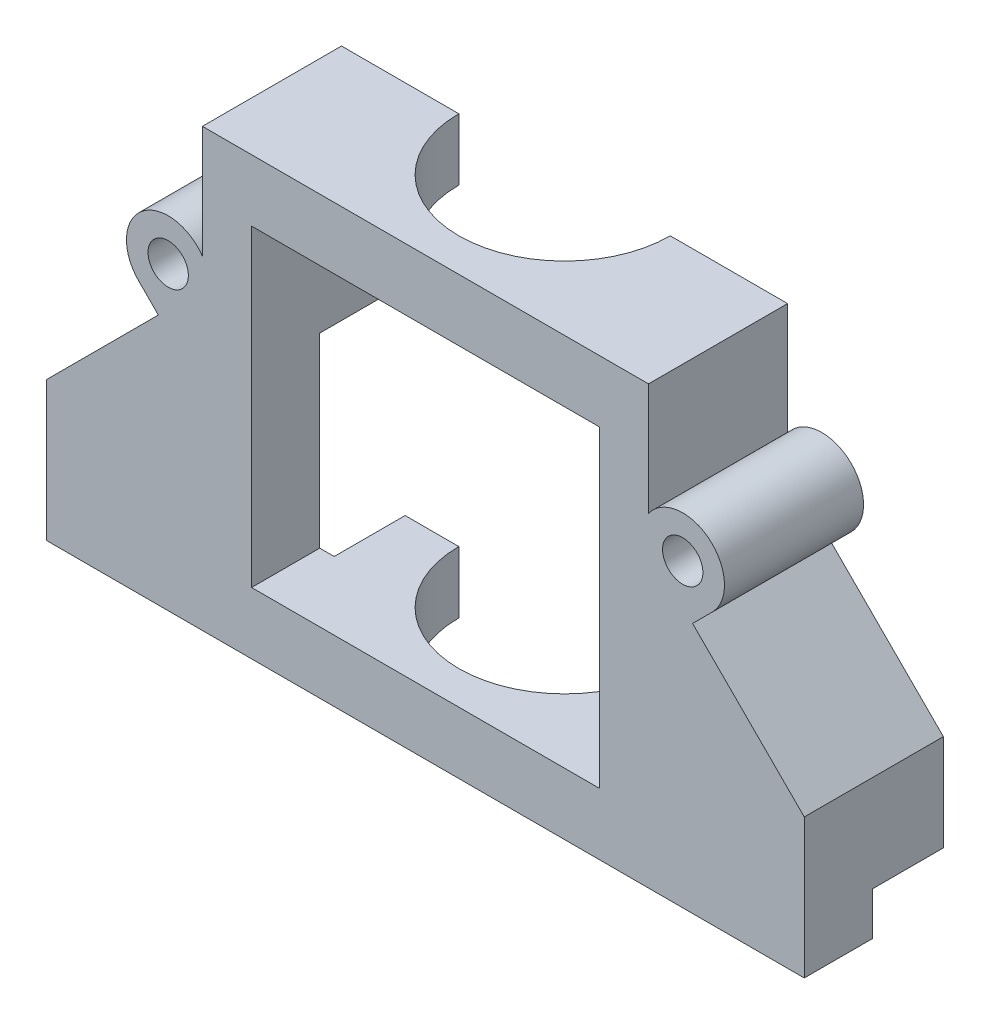
ISO-10303-21;
HEADER;
FILE_DESCRIPTION(('STEP AP214'),'2;1');
FILE_NAME('part.step','',(''),(''),'','','');
FILE_SCHEMA(('AUTOMOTIVE_DESIGN { 1 0 10303 214 1 1 1 1 }'));
ENDSEC;
DATA;
#1=APPLICATION_CONTEXT('core data for automotive mechanical design processes');
#2=APPLICATION_PROTOCOL_DEFINITION('international standard','automotive_design',2000,#1);
#3=PRODUCT_CONTEXT('',#1,'mechanical');
#4=PRODUCT('Part','Part','',(#3));
#5=PRODUCT_RELATED_PRODUCT_CATEGORY('part','',(#4));
#6=PRODUCT_DEFINITION_FORMATION('','',#4);
#7=PRODUCT_DEFINITION_CONTEXT('part definition',#1,'design');
#8=PRODUCT_DEFINITION('design','',#6,#7);
#9=PRODUCT_DEFINITION_SHAPE('','',#8);
#10=(LENGTH_UNIT() NAMED_UNIT(*) SI_UNIT(.MILLI.,.METRE.));
#11=(NAMED_UNIT(*) PLANE_ANGLE_UNIT() SI_UNIT($,.RADIAN.));
#12=(NAMED_UNIT(*) SI_UNIT($,.STERADIAN.) SOLID_ANGLE_UNIT());
#13=UNCERTAINTY_MEASURE_WITH_UNIT(LENGTH_MEASURE(1.E-05),#10,'distance_accuracy_value','');
#14=(GEOMETRIC_REPRESENTATION_CONTEXT(3) GLOBAL_UNCERTAINTY_ASSIGNED_CONTEXT((#13)) GLOBAL_UNIT_ASSIGNED_CONTEXT((#10,
#11,#12)) REPRESENTATION_CONTEXT('',''));
#15=CARTESIAN_POINT('',(0.,0.,0.));
#16=DIRECTION('',(0.,0.,1.));
#17=DIRECTION('',(1.,0.,0.));
#18=AXIS2_PLACEMENT_3D('',#15,#16,#17);
#19=CARTESIAN_POINT('',(69.1731378358659,19.3936469520584,-25.4));
#20=DIRECTION('',(0.,-1.,0.));
#21=DIRECTION('',(1.,0.,0.));
#22=AXIS2_PLACEMENT_3D('',#19,#20,#21);
#23=PLANE('',#22);
#24=DIRECTION('',(1.,0.,0.));
#25=VECTOR('',#24,1.);
#26=CARTESIAN_POINT('',(-40.4032328030978,19.3936469520584,12.954));
#27=LINE('',#26,#25);
#28=CARTESIAN_POINT('',(-69.1731378358659,19.3936469520584,12.954));
#29=VERTEX_POINT('',#28);
#30=CARTESIAN_POINT('',(-40.4032328030978,19.3936469520584,12.954));
#31=VERTEX_POINT('',#30);
#32=EDGE_CURVE('E245',#29,#31,#27,.T.);
#33=ORIENTED_EDGE('',*,*,#32,.T.);
#34=DIRECTION('',(0.,0.,-1.));
#35=VECTOR('',#34,1.);
#36=CARTESIAN_POINT('',(-40.4032328030978,19.3936469520584,12.954));
#37=LINE('',#36,#35);
#38=CARTESIAN_POINT('',(-40.4032328030978,19.3936469520584,0.));
#39=VERTEX_POINT('',#38);
#40=EDGE_CURVE('E243',#31,#39,#37,.T.);
#41=ORIENTED_EDGE('',*,*,#40,.T.);
#42=DIRECTION('',(1.,0.,0.));
#43=VECTOR('',#42,1.);
#44=CARTESIAN_POINT('',(-69.1731378358659,19.3936469520584,0.));
#45=LINE('',#44,#43);
#46=CARTESIAN_POINT('',(-19.304,19.3936469520584,0.));
#47=VERTEX_POINT('',#46);
#48=EDGE_CURVE('E395',#39,#47,#45,.T.);
#49=ORIENTED_EDGE('',*,*,#48,.T.);
#50=CARTESIAN_POINT('',(0.,19.3936469520584,0.));
#51=DIRECTION('',(0.,-1.,0.));
#52=DIRECTION('',(-1.,0.,0.));
#53=AXIS2_PLACEMENT_3D('',#50,#51,#52);
#54=CIRCLE('',#53,19.304);
#55=CARTESIAN_POINT('',(19.304,19.3936469520584,0.));
#56=VERTEX_POINT('',#55);
#57=EDGE_CURVE('E302',#56,#47,#54,.T.);
#58=ORIENTED_EDGE('',*,*,#57,.F.);
#59=CARTESIAN_POINT('',(40.4032328030978,19.3936469520584,0.));
#60=VERTEX_POINT('',#59);
#61=EDGE_CURVE('E376',#56,#60,#45,.T.);
#62=ORIENTED_EDGE('',*,*,#61,.T.);
#63=DIRECTION('',(0.,0.,-1.));
#64=VECTOR('',#63,1.);
#65=CARTESIAN_POINT('',(40.4032328030978,19.3936469520584,12.954));
#66=LINE('',#65,#64);
#67=CARTESIAN_POINT('',(40.4032328030978,19.3936469520584,12.954));
#68=VERTEX_POINT('',#67);
#69=EDGE_CURVE('E70',#68,#60,#66,.T.);
#70=ORIENTED_EDGE('',*,*,#69,.F.);
#71=DIRECTION('',(-1.,0.,0.));
#72=VECTOR('',#71,1.);
#73=CARTESIAN_POINT('',(40.4032328030978,19.3936469520584,12.954));
#74=LINE('',#73,#72);
#75=CARTESIAN_POINT('',(69.1731378358659,19.3936469520584,12.954));
#76=VERTEX_POINT('',#75);
#77=EDGE_CURVE('E276',#76,#68,#74,.T.);
#78=ORIENTED_EDGE('',*,*,#77,.F.);
#79=DIRECTION('',(0.,0.,1.));
#80=VECTOR('',#79,1.);
#81=CARTESIAN_POINT('',(69.1731378358659,19.3936469520584,-25.4));
#82=LINE('',#81,#80);
#83=CARTESIAN_POINT('',(69.1731378358659,19.3936469520584,25.4));
#84=VERTEX_POINT('',#83);
#85=EDGE_CURVE('E506',#76,#84,#82,.T.);
#86=ORIENTED_EDGE('',*,*,#85,.T.);
#87=DIRECTION('',(1.,0.,0.));
#88=VECTOR('',#87,1.);
#89=CARTESIAN_POINT('',(69.1731378358659,19.3936469520584,25.4));
#90=LINE('',#89,#88);
#91=CARTESIAN_POINT('',(-69.1731378358659,19.3936469520584,25.4));
#92=VERTEX_POINT('',#91);
#93=EDGE_CURVE('E495',#92,#84,#90,.T.);
#94=ORIENTED_EDGE('',*,*,#93,.F.);
#95=DIRECTION('',(0.,0.,1.));
#96=VECTOR('',#95,1.);
#97=CARTESIAN_POINT('',(-69.1731378358659,19.3936469520584,-25.4));
#98=LINE('',#97,#96);
#99=EDGE_CURVE('E505',#29,#92,#98,.T.);
#100=ORIENTED_EDGE('',*,*,#99,.F.);
#101=EDGE_LOOP('',(#33,#41,#49,#58,#62,#70,#78,#86,#94,#100));
#102=FACE_BOUND('',#101,.T.);
#103=ADVANCED_FACE('F46',(#102),#23,.T.);
#104=CARTESIAN_POINT('',(-69.1731378358659,19.3936469520584,-25.4));
#105=DIRECTION('',(-1.,0.,0.));
#106=DIRECTION('',(0.,0.,1.));
#107=AXIS2_PLACEMENT_3D('',#104,#105,#106);
#108=PLANE('',#107);
#109=DIRECTION('',(0.,-1.,0.));
#110=VECTOR('',#109,1.);
#111=CARTESIAN_POINT('',(-69.1731378358659,44.8644888905493,0.));
#112=LINE('',#111,#110);
#113=CARTESIAN_POINT('',(-69.1731378358659,44.8644888905493,0.));
#114=VERTEX_POINT('',#113);
#115=CARTESIAN_POINT('',(-69.1731378358659,27.2631868932537,0.));
#116=VERTEX_POINT('',#115);
#117=EDGE_CURVE('E416',#114,#116,#112,.T.);
#118=ORIENTED_EDGE('',*,*,#117,.T.);
#119=DIRECTION('',(0.,0.,-1.));
#120=VECTOR('',#119,1.);
#121=CARTESIAN_POINT('',(-69.1731378358659,27.2631868932537,12.954));
#122=LINE('',#121,#120);
#123=CARTESIAN_POINT('',(-69.1731378358659,27.2631868932537,12.954));
#124=VERTEX_POINT('',#123);
#125=EDGE_CURVE('E258',#124,#116,#122,.T.);
#126=ORIENTED_EDGE('',*,*,#125,.F.);
#127=DIRECTION('',(0.,-1.,0.));
#128=VECTOR('',#127,1.);
#129=CARTESIAN_POINT('',(-69.1731378358659,19.3936469520584,12.954));
#130=LINE('',#129,#128);
#131=EDGE_CURVE('E260',#124,#29,#130,.T.);
#132=ORIENTED_EDGE('',*,*,#131,.T.);
#133=ORIENTED_EDGE('',*,*,#99,.T.);
#134=DIRECTION('',(0.,-1.,0.));
#135=VECTOR('',#134,1.);
#136=CARTESIAN_POINT('',(-69.1731378358659,19.3936469520584,25.4));
#137=LINE('',#136,#135);
#138=CARTESIAN_POINT('',(-69.1731378358659,44.8644888905493,25.4));
#139=VERTEX_POINT('',#138);
#140=EDGE_CURVE('E481',#139,#92,#137,.T.);
#141=ORIENTED_EDGE('',*,*,#140,.F.);
#142=DIRECTION('',(0.,0.,1.));
#143=VECTOR('',#142,1.);
#144=CARTESIAN_POINT('',(-69.1731378358659,44.8644888905493,-25.4));
#145=LINE('',#144,#143);
#146=EDGE_CURVE('E457',#114,#139,#145,.T.);
#147=ORIENTED_EDGE('',*,*,#146,.F.);
#148=EDGE_LOOP('',(#118,#126,#132,#133,#141,#147));
#149=FACE_BOUND('',#148,.T.);
#150=ADVANCED_FACE('F48',(#149),#108,.T.);
#151=CARTESIAN_POINT('',(-31.75,30.6845674544502,-25.4));
#152=DIRECTION('',(-1.,0.,0.));
#153=DIRECTION('',(0.,0.,1.));
#154=AXIS2_PLACEMENT_3D('',#151,#152,#153);
#155=PLANE('',#154);
#156=DIRECTION('',(0.,0.,1.));
#157=VECTOR('',#156,1.);
#158=CARTESIAN_POINT('',(-31.75,64.6863247291196,-25.4));
#159=LINE('',#158,#157);
#160=CARTESIAN_POINT('',(-31.75,64.6863247291196,0.));
#161=VERTEX_POINT('',#160);
#162=CARTESIAN_POINT('',(-31.75,64.6863247291196,12.954));
#163=VERTEX_POINT('',#162);
#164=EDGE_CURVE('E264',#161,#163,#159,.T.);
#165=ORIENTED_EDGE('',*,*,#164,.F.);
#166=DIRECTION('',(0.,1.,0.));
#167=VECTOR('',#166,1.);
#168=CARTESIAN_POINT('',(-31.75,30.6845674544502,0.));
#169=LINE('',#168,#167);
#170=CARTESIAN_POINT('',(-31.75,87.8345674544502,0.));
#171=VERTEX_POINT('',#170);
#172=EDGE_CURVE('E428',#161,#171,#169,.T.);
#173=ORIENTED_EDGE('',*,*,#172,.T.);
#174=DIRECTION('',(0.,0.,1.));
#175=VECTOR('',#174,1.);
#176=CARTESIAN_POINT('',(-31.75,87.8345674544502,-25.4));
#177=LINE('',#176,#175);
#178=CARTESIAN_POINT('',(-31.75,87.8345674544502,25.4));
#179=VERTEX_POINT('',#178);
#180=EDGE_CURVE('E485',#171,#179,#177,.T.);
#181=ORIENTED_EDGE('',*,*,#180,.T.);
#182=DIRECTION('',(0.,-1.,0.));
#183=VECTOR('',#182,1.);
#184=CARTESIAN_POINT('',(-31.75,30.6845674544502,25.4));
#185=LINE('',#184,#183);
#186=CARTESIAN_POINT('',(-31.75,30.6845674544502,25.4));
#187=VERTEX_POINT('',#186);
#188=EDGE_CURVE('E469',#179,#187,#185,.T.);
#189=ORIENTED_EDGE('',*,*,#188,.T.);
#190=DIRECTION('',(0.,0.,1.));
#191=VECTOR('',#190,1.);
#192=CARTESIAN_POINT('',(-31.75,30.6845674544502,-25.4));
#193=LINE('',#192,#191);
#194=CARTESIAN_POINT('',(-31.75,30.6845674544502,12.954));
#195=VERTEX_POINT('',#194);
#196=EDGE_CURVE('E482',#195,#187,#193,.T.);
#197=ORIENTED_EDGE('',*,*,#196,.F.);
#198=DIRECTION('',(0.,-1.,0.));
#199=VECTOR('',#198,1.);
#200=CARTESIAN_POINT('',(-31.75,30.6845674544502,12.954));
#201=LINE('',#200,#199);
#202=EDGE_CURVE('E238',#163,#195,#201,.T.);
#203=ORIENTED_EDGE('',*,*,#202,.F.);
#204=EDGE_LOOP('',(#165,#173,#181,#189,#197,#203));
#205=FACE_BOUND('',#204,.T.);
#206=ADVANCED_FACE('F531',(#205),#155,.F.);
#207=CARTESIAN_POINT('',(-31.75,30.6845674544502,-25.4));
#208=DIRECTION('',(0.,-1.,0.));
#209=DIRECTION('',(0.,0.,-1.));
#210=AXIS2_PLACEMENT_3D('',#207,#208,#209);
#211=PLANE('',#210);
#212=DIRECTION('',(0.,0.,-1.));
#213=VECTOR('',#212,1.);
#214=CARTESIAN_POINT('',(-29.1123123007059,30.6845674544502,12.954));
#215=LINE('',#214,#213);
#216=CARTESIAN_POINT('',(-29.1123123007059,30.6845674544502,12.954));
#217=VERTEX_POINT('',#216);
#218=CARTESIAN_POINT('',(-29.1123123007059,30.6845674544502,0.));
#219=VERTEX_POINT('',#218);
#220=EDGE_CURVE('E62',#217,#219,#215,.T.);
#221=ORIENTED_EDGE('',*,*,#220,.F.);
#222=DIRECTION('',(1.,0.,0.));
#223=VECTOR('',#222,1.);
#224=CARTESIAN_POINT('',(-31.75,30.6845674544502,12.954));
#225=LINE('',#224,#223);
#226=EDGE_CURVE('E11',#195,#217,#225,.T.);
#227=ORIENTED_EDGE('',*,*,#226,.F.);
#228=ORIENTED_EDGE('',*,*,#196,.T.);
#229=DIRECTION('',(1.,0.,0.));
#230=VECTOR('',#229,1.);
#231=CARTESIAN_POINT('',(-31.75,30.6845674544502,25.4));
#232=LINE('',#231,#230);
#233=CARTESIAN_POINT('',(31.75,30.6845674544502,25.4));
#234=VERTEX_POINT('',#233);
#235=EDGE_CURVE('E473',#187,#234,#232,.T.);
#236=ORIENTED_EDGE('',*,*,#235,.T.);
#237=DIRECTION('',(0.,0.,1.));
#238=VECTOR('',#237,1.);
#239=CARTESIAN_POINT('',(31.75,30.6845674544502,-25.4));
#240=LINE('',#239,#238);
#241=CARTESIAN_POINT('',(31.75,30.6845674544502,12.954));
#242=VERTEX_POINT('',#241);
#243=EDGE_CURVE('E478',#242,#234,#240,.T.);
#244=ORIENTED_EDGE('',*,*,#243,.F.);
#245=DIRECTION('',(1.,0.,0.));
#246=VECTOR('',#245,1.);
#247=CARTESIAN_POINT('',(-31.75,30.6845674544502,12.954));
#248=LINE('',#247,#246);
#249=CARTESIAN_POINT('',(29.1123123007059,30.6845674544502,12.954));
#250=VERTEX_POINT('',#249);
#251=EDGE_CURVE('E519',#250,#242,#248,.T.);
#252=ORIENTED_EDGE('',*,*,#251,.F.);
#253=DIRECTION('',(0.,0.,-1.));
#254=VECTOR('',#253,1.);
#255=CARTESIAN_POINT('',(29.1123123007059,30.6845674544502,12.954));
#256=LINE('',#255,#254);
#257=CARTESIAN_POINT('',(29.1123123007059,30.6845674544502,0.));
#258=VERTEX_POINT('',#257);
#259=EDGE_CURVE('E286',#250,#258,#256,.T.);
#260=ORIENTED_EDGE('',*,*,#259,.T.);
#261=DIRECTION('',(-1.,0.,0.));
#262=VECTOR('',#261,1.);
#263=CARTESIAN_POINT('',(-31.75,30.6845674544502,0.));
#264=LINE('',#263,#262);
#265=CARTESIAN_POINT('',(19.304,30.6845674544502,0.));
#266=VERTEX_POINT('',#265);
#267=EDGE_CURVE('E433',#258,#266,#264,.T.);
#268=ORIENTED_EDGE('',*,*,#267,.T.);
#269=CARTESIAN_POINT('',(0.,30.6845674544502,0.));
#270=DIRECTION('',(0.,-1.,0.));
#271=DIRECTION('',(0.,0.,-1.));
#272=AXIS2_PLACEMENT_3D('',#269,#270,#271);
#273=CIRCLE('',#272,19.304);
#274=CARTESIAN_POINT('',(-19.304,30.6845674544502,0.));
#275=VERTEX_POINT('',#274);
#276=EDGE_CURVE('E322',#266,#275,#273,.T.);
#277=ORIENTED_EDGE('',*,*,#276,.T.);
#278=EDGE_CURVE('E252',#275,#219,#264,.T.);
#279=ORIENTED_EDGE('',*,*,#278,.T.);
#280=EDGE_LOOP('',(#221,#227,#228,#236,#244,#252,#260,#268,#277,#279));
#281=FACE_BOUND('',#280,.T.);
#282=ADVANCED_FACE('F249',(#281),#211,.F.);
#283=CARTESIAN_POINT('',(0.,0.,0.));
#284=DIRECTION('',(0.,0.,1.));
#285=DIRECTION('',(1.,0.,0.));
#286=AXIS2_PLACEMENT_3D('',#283,#284,#285);
#287=PLANE('',#286);
#288=CARTESIAN_POINT('',(-46.9779464676183,74.2438851556522,0.));
#289=DIRECTION('',(0.,0.,1.));
#290=DIRECTION('',(1.,0.,0.));
#291=AXIS2_PLACEMENT_3D('',#288,#289,#290);
#292=CIRCLE('',#291,3.683);
#293=CARTESIAN_POINT('',(-43.2949464676183,74.2438851556522,0.));
#294=VERTEX_POINT('',#293);
#295=EDGE_CURVE('E341',#294,#294,#292,.T.);
#296=ORIENTED_EDGE('',*,*,#295,.T.);
#297=EDGE_LOOP('',(#296));
#298=FACE_BOUND('',#297,.T.);
#299=DIRECTION('',(0.707106781186548,0.707106781186548,0.));
#300=VECTOR('',#299,1.);
#301=CARTESIAN_POINT('',(-48.2181623645598,48.2181623645598,0.));
#302=LINE('',#301,#300);
#303=EDGE_CURVE('E55',#116,#161,#302,.T.);
#304=ORIENTED_EDGE('',*,*,#303,.F.);
#305=ORIENTED_EDGE('',*,*,#117,.F.);
#306=DIRECTION('',(-0.707106781186548,-0.707106781186547,0.));
#307=VECTOR('',#306,1.);
#308=CARTESIAN_POINT('',(-40.7302561210692,73.307370605346,0.));
#309=LINE('',#308,#307);
#310=CARTESIAN_POINT('',(-48.7739976918321,65.263629034583,0.));
#311=VERTEX_POINT('',#310);
#312=EDGE_CURVE('E413',#311,#114,#309,.T.);
#313=ORIENTED_EDGE('',*,*,#312,.F.);
#314=DIRECTION('',(0.707106781186548,-0.707106781186548,0.));
#315=VECTOR('',#314,1.);
#316=CARTESIAN_POINT('',(8.24481567137546,8.24481567137546,0.));
#317=LINE('',#316,#315);
#318=CARTESIAN_POINT('',(-52.3661001402598,68.8557314830107,0.));
#319=VERTEX_POINT('',#318);
#320=EDGE_CURVE('E333',#319,#311,#317,.T.);
#321=ORIENTED_EDGE('',*,*,#320,.F.);
#322=CARTESIAN_POINT('',(-46.9779464676183,74.2438851556522,0.));
#323=DIRECTION('',(0.,0.,1.));
#324=DIRECTION('',(1.,0.,0.));
#325=AXIS2_PLACEMENT_3D('',#322,#323,#324);
#326=CIRCLE('',#325,7.62);
#327=CARTESIAN_POINT('',(-40.7302561210692,78.6063116975709,0.));
#328=VERTEX_POINT('',#327);
#329=EDGE_CURVE('E337',#328,#319,#326,.T.);
#330=ORIENTED_EDGE('',*,*,#329,.F.);
#331=DIRECTION('',(0.,-1.,0.));
#332=VECTOR('',#331,1.);
#333=CARTESIAN_POINT('',(-40.7302561210692,99.125487956842,0.));
#334=LINE('',#333,#332);
#335=CARTESIAN_POINT('',(-40.7302561210692,99.125487956842,0.));
#336=VERTEX_POINT('',#335);
#337=EDGE_CURVE('E410',#336,#328,#334,.T.);
#338=ORIENTED_EDGE('',*,*,#337,.F.);
#339=DIRECTION('',(-1.,0.,0.));
#340=VECTOR('',#339,1.);
#341=CARTESIAN_POINT('',(40.7302561210692,99.125487956842,0.));
#342=LINE('',#341,#340);
#343=CARTESIAN_POINT('',(-19.304,99.1254879568421,0.));
#344=VERTEX_POINT('',#343);
#345=EDGE_CURVE('E405',#344,#336,#342,.T.);
#346=ORIENTED_EDGE('',*,*,#345,.F.);
#347=DIRECTION('',(0.,-1.,0.));
#348=VECTOR('',#347,1.);
#349=CARTESIAN_POINT('',(-19.304,99.1254879568421,0.));
#350=LINE('',#349,#348);
#351=CARTESIAN_POINT('',(-19.304,87.8345674544502,0.));
#352=VERTEX_POINT('',#351);
#353=EDGE_CURVE('E311',#344,#352,#350,.T.);
#354=ORIENTED_EDGE('',*,*,#353,.T.);
#355=DIRECTION('',(1.,0.,0.));
#356=VECTOR('',#355,1.);
#357=CARTESIAN_POINT('',(-31.75,87.8345674544502,0.));
#358=LINE('',#357,#356);
#359=EDGE_CURVE('E424',#171,#352,#358,.T.);
#360=ORIENTED_EDGE('',*,*,#359,.F.);
#361=ORIENTED_EDGE('',*,*,#172,.F.);
#362=EDGE_LOOP('',(#304,#305,#313,#321,#330,#338,#346,#354,#360,#361));
#363=FACE_BOUND('',#362,.T.);
#364=ADVANCED_FACE('F533',(#298,#363),#287,.F.);
#365=DIRECTION('',(0.707106781186549,0.707106781186546,0.));
#366=VECTOR('',#365,1.);
#367=CARTESIAN_POINT('',(-29.1123123007059,30.6845674544502,0.));
#368=LINE('',#367,#366);
#369=EDGE_CURVE('E246',#39,#219,#368,.T.);
#370=ORIENTED_EDGE('',*,*,#369,.T.);
#371=ORIENTED_EDGE('',*,*,#278,.F.);
#372=EDGE_CURVE('E316',#275,#47,#350,.T.);
#373=ORIENTED_EDGE('',*,*,#372,.T.);
#374=ORIENTED_EDGE('',*,*,#48,.F.);
#375=EDGE_LOOP('',(#370,#371,#373,#374));
#376=FACE_BOUND('',#375,.T.);
#377=ADVANCED_FACE('F618',(#376),#287,.F.);
#378=CARTESIAN_POINT('',(-57.0188133632076,57.0188133632076,-25.4));
#379=DIRECTION('',(0.707106781186547,-0.707106781186548,0.));
#380=DIRECTION('',(0.707106781186548,0.707106781186547,0.));
#381=AXIS2_PLACEMENT_3D('',#378,#379,#380);
#382=PLANE('',#381);
#383=DIRECTION('',(0.,0.,-1.));
#384=VECTOR('',#383,1.);
#385=CARTESIAN_POINT('',(-48.7739976918321,65.263629034583,113.310611658588));
#386=LINE('',#385,#384);
#387=CARTESIAN_POINT('',(-48.7739976918321,65.263629034583,25.4));
#388=VERTEX_POINT('',#387);
#389=EDGE_CURVE('E345',#388,#311,#386,.T.);
#390=ORIENTED_EDGE('',*,*,#389,.T.);
#391=ORIENTED_EDGE('',*,*,#312,.T.);
#392=ORIENTED_EDGE('',*,*,#146,.T.);
#393=DIRECTION('',(0.707106781186548,0.707106781186547,0.));
#394=VECTOR('',#393,1.);
#395=CARTESIAN_POINT('',(-57.0188133632076,57.0188133632076,25.4));
#396=LINE('',#395,#394);
#397=EDGE_CURVE('E446',#139,#388,#396,.T.);
#398=ORIENTED_EDGE('',*,*,#397,.T.);
#399=EDGE_LOOP('',(#390,#391,#392,#398));
#400=FACE_BOUND('',#399,.T.);
#401=ADVANCED_FACE('F620',(#400),#382,.F.);
#402=CARTESIAN_POINT('',(-40.7302561210692,0.,-25.4));
#403=DIRECTION('',(1.,0.,0.));
#404=DIRECTION('',(0.,0.,-1.));
#405=AXIS2_PLACEMENT_3D('',#402,#403,#404);
#406=PLANE('',#405);
#407=DIRECTION('',(0.,1.,0.));
#408=VECTOR('',#407,1.);
#409=CARTESIAN_POINT('',(-40.7302561210692,0.,25.4));
#410=LINE('',#409,#408);
#411=CARTESIAN_POINT('',(-40.7302561210692,78.6063116975709,25.4));
#412=VERTEX_POINT('',#411);
#413=CARTESIAN_POINT('',(-40.7302561210692,99.125487956842,25.4));
#414=VERTEX_POINT('',#413);
#415=EDGE_CURVE('E452',#412,#414,#410,.T.);
#416=ORIENTED_EDGE('',*,*,#415,.T.);
#417=DIRECTION('',(0.,0.,1.));
#418=VECTOR('',#417,1.);
#419=CARTESIAN_POINT('',(-40.7302561210692,99.125487956842,-25.4));
#420=LINE('',#419,#418);
#421=EDGE_CURVE('E456',#336,#414,#420,.T.);
#422=ORIENTED_EDGE('',*,*,#421,.F.);
#423=ORIENTED_EDGE('',*,*,#337,.T.);
#424=DIRECTION('',(0.,0.,-1.));
#425=VECTOR('',#424,1.);
#426=CARTESIAN_POINT('',(-40.7302561210692,78.6063116975709,113.310611658588));
#427=LINE('',#426,#425);
#428=EDGE_CURVE('E346',#412,#328,#427,.T.);
#429=ORIENTED_EDGE('',*,*,#428,.F.);
#430=EDGE_LOOP('',(#416,#422,#423,#429));
#431=FACE_BOUND('',#430,.T.);
#432=ADVANCED_FACE('F610',(#431),#406,.F.);
#433=CARTESIAN_POINT('',(69.1731378358659,99.125487956842,-25.4));
#434=DIRECTION('',(0.,1.,0.));
#435=DIRECTION('',(0.,0.,1.));
#436=AXIS2_PLACEMENT_3D('',#433,#434,#435);
#437=PLANE('',#436);
#438=CARTESIAN_POINT('',(0.,99.1254879568421,0.));
#439=DIRECTION('',(0.,-1.,0.));
#440=DIRECTION('',(-1.,0.,0.));
#441=AXIS2_PLACEMENT_3D('',#438,#439,#440);
#442=CIRCLE('',#441,19.304);
#443=CARTESIAN_POINT('',(19.304,99.1254879568421,0.));
#444=VERTEX_POINT('',#443);
#445=EDGE_CURVE('E303',#444,#344,#442,.T.);
#446=ORIENTED_EDGE('',*,*,#445,.T.);
#447=ORIENTED_EDGE('',*,*,#345,.T.);
#448=ORIENTED_EDGE('',*,*,#421,.T.);
#449=DIRECTION('',(-1.,0.,0.));
#450=VECTOR('',#449,1.);
#451=CARTESIAN_POINT('',(69.1731378358659,99.125487956842,25.4));
#452=LINE('',#451,#450);
#453=CARTESIAN_POINT('',(40.7302561210692,99.125487956842,25.4));
#454=VERTEX_POINT('',#453);
#455=EDGE_CURVE('E502',#454,#414,#452,.T.);
#456=ORIENTED_EDGE('',*,*,#455,.F.);
#457=DIRECTION('',(0.,0.,1.));
#458=VECTOR('',#457,1.);
#459=CARTESIAN_POINT('',(40.7302561210692,99.125487956842,-25.4));
#460=LINE('',#459,#458);
#461=CARTESIAN_POINT('',(40.7302561210692,99.125487956842,0.));
#462=VERTEX_POINT('',#461);
#463=EDGE_CURVE('E442',#462,#454,#460,.T.);
#464=ORIENTED_EDGE('',*,*,#463,.F.);
#465=EDGE_CURVE('E406',#462,#444,#342,.T.);
#466=ORIENTED_EDGE('',*,*,#465,.T.);
#467=EDGE_LOOP('',(#446,#447,#448,#456,#464,#466));
#468=FACE_BOUND('',#467,.T.);
#469=ADVANCED_FACE('F614',(#468),#437,.T.);
#470=CARTESIAN_POINT('',(69.1731378358659,19.3936469520584,-25.4));
#471=DIRECTION('',(1.,0.,0.));
#472=DIRECTION('',(0.,0.,-1.));
#473=AXIS2_PLACEMENT_3D('',#470,#471,#472);
#474=PLANE('',#473);
#475=DIRECTION('',(0.,0.,-1.));
#476=VECTOR('',#475,1.);
#477=CARTESIAN_POINT('',(69.1731378358659,27.2631868932537,12.954));
#478=LINE('',#477,#476);
#479=CARTESIAN_POINT('',(69.1731378358659,27.2631868932537,12.954));
#480=VERTEX_POINT('',#479);
#481=CARTESIAN_POINT('',(69.1731378358659,27.2631868932537,0.));
#482=VERTEX_POINT('',#481);
#483=EDGE_CURVE('E283',#480,#482,#478,.T.);
#484=ORIENTED_EDGE('',*,*,#483,.T.);
#485=DIRECTION('',(0.,1.,0.));
#486=VECTOR('',#485,1.);
#487=CARTESIAN_POINT('',(69.1731378358659,19.3936469520584,0.));
#488=LINE('',#487,#486);
#489=CARTESIAN_POINT('',(69.1731378358659,44.8644888905493,0.));
#490=VERTEX_POINT('',#489);
#491=EDGE_CURVE('E396',#482,#490,#488,.T.);
#492=ORIENTED_EDGE('',*,*,#491,.T.);
#493=DIRECTION('',(0.,0.,1.));
#494=VECTOR('',#493,1.);
#495=CARTESIAN_POINT('',(69.1731378358659,44.8644888905493,-25.4));
#496=LINE('',#495,#494);
#497=CARTESIAN_POINT('',(69.1731378358659,44.8644888905493,25.4));
#498=VERTEX_POINT('',#497);
#499=EDGE_CURVE('E441',#490,#498,#496,.T.);
#500=ORIENTED_EDGE('',*,*,#499,.T.);
#501=DIRECTION('',(0.,1.,0.));
#502=VECTOR('',#501,1.);
#503=CARTESIAN_POINT('',(69.1731378358659,19.3936469520584,25.4));
#504=LINE('',#503,#502);
#505=EDGE_CURVE('E499',#84,#498,#504,.T.);
#506=ORIENTED_EDGE('',*,*,#505,.F.);
#507=ORIENTED_EDGE('',*,*,#85,.F.);
#508=DIRECTION('',(0.,-1.,0.));
#509=VECTOR('',#508,1.);
#510=CARTESIAN_POINT('',(69.1731378358659,19.3936469520584,12.954));
#511=LINE('',#510,#509);
#512=EDGE_CURVE('E273',#480,#76,#511,.T.);
#513=ORIENTED_EDGE('',*,*,#512,.F.);
#514=EDGE_LOOP('',(#484,#492,#500,#506,#507,#513));
#515=FACE_BOUND('',#514,.T.);
#516=ADVANCED_FACE('F563',(#515),#474,.T.);
#517=CARTESIAN_POINT('',(0.,0.,25.4));
#518=DIRECTION('',(0.,0.,1.));
#519=DIRECTION('',(1.,0.,0.));
#520=AXIS2_PLACEMENT_3D('',#517,#518,#519);
#521=PLANE('',#520);
#522=ORIENTED_EDGE('',*,*,#188,.F.);
#523=DIRECTION('',(-1.,0.,0.));
#524=VECTOR('',#523,1.);
#525=CARTESIAN_POINT('',(-31.75,87.8345674544502,25.4));
#526=LINE('',#525,#524);
#527=CARTESIAN_POINT('',(31.75,87.8345674544502,25.4));
#528=VERTEX_POINT('',#527);
#529=EDGE_CURVE('E466',#528,#179,#526,.T.);
#530=ORIENTED_EDGE('',*,*,#529,.F.);
#531=DIRECTION('',(0.,1.,0.));
#532=VECTOR('',#531,1.);
#533=CARTESIAN_POINT('',(31.75,30.6845674544502,25.4));
#534=LINE('',#533,#532);
#535=EDGE_CURVE('E460',#234,#528,#534,.T.);
#536=ORIENTED_EDGE('',*,*,#535,.F.);
#537=ORIENTED_EDGE('',*,*,#235,.F.);
#538=EDGE_LOOP('',(#522,#530,#536,#537));
#539=FACE_BOUND('',#538,.T.);
#540=ORIENTED_EDGE('',*,*,#455,.T.);
#541=ORIENTED_EDGE('',*,*,#415,.F.);
#542=CARTESIAN_POINT('',(-46.9779464676183,74.2438851556522,25.4));
#543=DIRECTION('',(0.,0.,1.));
#544=DIRECTION('',(1.,0.,0.));
#545=AXIS2_PLACEMENT_3D('',#542,#543,#544);
#546=CIRCLE('',#545,7.62);
#547=CARTESIAN_POINT('',(-52.3661001402598,68.8557314830107,25.4));
#548=VERTEX_POINT('',#547);
#549=EDGE_CURVE('E330',#412,#548,#546,.T.);
#550=ORIENTED_EDGE('',*,*,#549,.T.);
#551=DIRECTION('',(0.707106781186548,-0.707106781186548,0.));
#552=VECTOR('',#551,1.);
#553=CARTESIAN_POINT('',(8.24481567137546,8.24481567137546,25.4));
#554=LINE('',#553,#552);
#555=EDGE_CURVE('E326',#548,#388,#554,.T.);
#556=ORIENTED_EDGE('',*,*,#555,.T.);
#557=ORIENTED_EDGE('',*,*,#397,.F.);
#558=ORIENTED_EDGE('',*,*,#140,.T.);
#559=ORIENTED_EDGE('',*,*,#93,.T.);
#560=ORIENTED_EDGE('',*,*,#505,.T.);
#561=DIRECTION('',(-0.707106781186548,0.707106781186547,0.));
#562=VECTOR('',#561,1.);
#563=CARTESIAN_POINT('',(57.0188133632076,57.0188133632076,25.4));
#564=LINE('',#563,#562);
#565=CARTESIAN_POINT('',(48.7739976918321,65.263629034583,25.4));
#566=VERTEX_POINT('',#565);
#567=EDGE_CURVE('E434',#498,#566,#564,.T.);
#568=ORIENTED_EDGE('',*,*,#567,.T.);
#569=DIRECTION('',(-0.707106781186548,-0.707106781186548,0.));
#570=VECTOR('',#569,1.);
#571=CARTESIAN_POINT('',(-8.24481567137546,8.24481567137546,25.4));
#572=LINE('',#571,#570);
#573=CARTESIAN_POINT('',(52.3661001402598,68.8557314830107,25.4));
#574=VERTEX_POINT('',#573);
#575=EDGE_CURVE('E350',#574,#566,#572,.T.);
#576=ORIENTED_EDGE('',*,*,#575,.F.);
#577=CARTESIAN_POINT('',(46.9779464676183,74.2438851556522,25.4));
#578=DIRECTION('',(0.,0.,1.));
#579=DIRECTION('',(1.,0.,0.));
#580=AXIS2_PLACEMENT_3D('',#577,#578,#579);
#581=CIRCLE('',#580,7.62);
#582=CARTESIAN_POINT('',(40.7302561210692,78.6063116975709,25.4));
#583=VERTEX_POINT('',#582);
#584=EDGE_CURVE('E377',#583,#574,#581,.F.);
#585=ORIENTED_EDGE('',*,*,#584,.F.);
#586=DIRECTION('',(0.,1.,0.));
#587=VECTOR('',#586,1.);
#588=CARTESIAN_POINT('',(40.7302561210692,0.,25.4));
#589=LINE('',#588,#587);
#590=EDGE_CURVE('E438',#583,#454,#589,.T.);
#591=ORIENTED_EDGE('',*,*,#590,.T.);
#592=EDGE_LOOP('',(#540,#541,#550,#556,#557,#558,#559,#560,#568,#576,#585,#591));
#593=FACE_BOUND('',#592,.T.);
#594=CARTESIAN_POINT('',(46.9779464676183,74.2438851556522,25.4));
#595=DIRECTION('',(0.,0.,1.));
#596=DIRECTION('',(1.,0.,0.));
#597=AXIS2_PLACEMENT_3D('',#594,#595,#596);
#598=CIRCLE('',#597,3.683);
#599=CARTESIAN_POINT('',(50.6609464676183,74.2438851556522,25.4));
#600=VERTEX_POINT('',#599);
#601=EDGE_CURVE('E369',#600,#600,#598,.F.);
#602=ORIENTED_EDGE('',*,*,#601,.T.);
#603=EDGE_LOOP('',(#602));
#604=FACE_BOUND('',#603,.T.);
#605=CARTESIAN_POINT('',(-46.9779464676183,74.2438851556522,25.4));
#606=DIRECTION('',(0.,0.,1.));
#607=DIRECTION('',(1.,0.,0.));
#608=AXIS2_PLACEMENT_3D('',#605,#606,#607);
#609=CIRCLE('',#608,3.683);
#610=CARTESIAN_POINT('',(-43.2949464676183,74.2438851556522,25.4));
#611=VERTEX_POINT('',#610);
#612=EDGE_CURVE('E325',#611,#611,#609,.T.);
#613=ORIENTED_EDGE('',*,*,#612,.F.);
#614=EDGE_LOOP('',(#613));
#615=FACE_BOUND('',#614,.T.);
#616=ADVANCED_FACE('F544',(#539,#593,#604,#615),#521,.T.);
#617=CARTESIAN_POINT('',(31.75,30.6845674544502,-25.4));
#618=DIRECTION('',(1.,0.,0.));
#619=DIRECTION('',(0.,0.,-1.));
#620=AXIS2_PLACEMENT_3D('',#617,#618,#619);
#621=PLANE('',#620);
#622=DIRECTION('',(0.,-1.,0.));
#623=VECTOR('',#622,1.);
#624=CARTESIAN_POINT('',(31.75,30.6845674544502,0.));
#625=LINE('',#624,#623);
#626=CARTESIAN_POINT('',(31.75,87.8345674544502,0.));
#627=VERTEX_POINT('',#626);
#628=CARTESIAN_POINT('',(31.75,64.6863247291196,0.));
#629=VERTEX_POINT('',#628);
#630=EDGE_CURVE('E423',#627,#629,#625,.T.);
#631=ORIENTED_EDGE('',*,*,#630,.T.);
#632=DIRECTION('',(0.,0.,1.));
#633=VECTOR('',#632,1.);
#634=CARTESIAN_POINT('',(31.75,64.6863247291196,-25.4));
#635=LINE('',#634,#633);
#636=CARTESIAN_POINT('',(31.75,64.6863247291196,12.954));
#637=VERTEX_POINT('',#636);
#638=EDGE_CURVE('E290',#629,#637,#635,.T.);
#639=ORIENTED_EDGE('',*,*,#638,.T.);
#640=DIRECTION('',(0.,1.,0.));
#641=VECTOR('',#640,1.);
#642=CARTESIAN_POINT('',(31.75,30.6845674544502,12.954));
#643=LINE('',#642,#641);
#644=EDGE_CURVE('E299',#242,#637,#643,.T.);
#645=ORIENTED_EDGE('',*,*,#644,.F.);
#646=ORIENTED_EDGE('',*,*,#243,.T.);
#647=ORIENTED_EDGE('',*,*,#535,.T.);
#648=DIRECTION('',(0.,0.,1.));
#649=VECTOR('',#648,1.);
#650=CARTESIAN_POINT('',(31.75,87.8345674544502,-25.4));
#651=LINE('',#650,#649);
#652=EDGE_CURVE('E477',#627,#528,#651,.T.);
#653=ORIENTED_EDGE('',*,*,#652,.F.);
#654=EDGE_LOOP('',(#631,#639,#645,#646,#647,#653));
#655=FACE_BOUND('',#654,.T.);
#656=ADVANCED_FACE('F551',(#655),#621,.F.);
#657=CARTESIAN_POINT('',(-31.75,87.8345674544502,-25.4));
#658=DIRECTION('',(0.,1.,0.));
#659=DIRECTION('',(0.,0.,1.));
#660=AXIS2_PLACEMENT_3D('',#657,#658,#659);
#661=PLANE('',#660);
#662=ORIENTED_EDGE('',*,*,#359,.T.);
#663=CARTESIAN_POINT('',(0.,87.8345674544502,0.));
#664=DIRECTION('',(0.,1.,0.));
#665=DIRECTION('',(0.,0.,1.));
#666=AXIS2_PLACEMENT_3D('',#663,#664,#665);
#667=CIRCLE('',#666,19.304);
#668=CARTESIAN_POINT('',(19.304,87.8345674544502,0.));
#669=VERTEX_POINT('',#668);
#670=EDGE_CURVE('E315',#352,#669,#667,.T.);
#671=ORIENTED_EDGE('',*,*,#670,.T.);
#672=EDGE_CURVE('E420',#669,#627,#358,.T.);
#673=ORIENTED_EDGE('',*,*,#672,.T.);
#674=ORIENTED_EDGE('',*,*,#652,.T.);
#675=ORIENTED_EDGE('',*,*,#529,.T.);
#676=ORIENTED_EDGE('',*,*,#180,.F.);
#677=EDGE_LOOP('',(#662,#671,#673,#674,#675,#676));
#678=FACE_BOUND('',#677,.T.);
#679=ADVANCED_FACE('F539',(#678),#661,.F.);
#680=CARTESIAN_POINT('',(57.0188133632076,57.0188133632076,-25.4));
#681=DIRECTION('',(0.707106781186547,0.707106781186548,0.));
#682=DIRECTION('',(-0.707106781186548,0.707106781186547,0.));
#683=AXIS2_PLACEMENT_3D('',#680,#681,#682);
#684=PLANE('',#683);
#685=DIRECTION('',(0.,0.,-1.));
#686=VECTOR('',#685,1.);
#687=CARTESIAN_POINT('',(48.7739976918321,65.263629034583,113.310611658588));
#688=LINE('',#687,#686);
#689=CARTESIAN_POINT('',(48.7739976918321,65.263629034583,0.));
#690=VERTEX_POINT('',#689);
#691=EDGE_CURVE('E381',#566,#690,#688,.T.);
#692=ORIENTED_EDGE('',*,*,#691,.F.);
#693=ORIENTED_EDGE('',*,*,#567,.F.);
#694=ORIENTED_EDGE('',*,*,#499,.F.);
#695=DIRECTION('',(-0.707106781186548,0.707106781186547,0.));
#696=VECTOR('',#695,1.);
#697=CARTESIAN_POINT('',(69.1731378358659,44.8644888905493,0.));
#698=LINE('',#697,#696);
#699=EDGE_CURVE('E399',#490,#690,#698,.T.);
#700=ORIENTED_EDGE('',*,*,#699,.T.);
#701=EDGE_LOOP('',(#692,#693,#694,#700));
#702=FACE_BOUND('',#701,.T.);
#703=ADVANCED_FACE('F648',(#702),#684,.T.);
#704=CARTESIAN_POINT('',(40.7302561210692,0.,-25.4));
#705=DIRECTION('',(1.,0.,0.));
#706=DIRECTION('',(0.,0.,-1.));
#707=AXIS2_PLACEMENT_3D('',#704,#705,#706);
#708=PLANE('',#707);
#709=ORIENTED_EDGE('',*,*,#463,.T.);
#710=ORIENTED_EDGE('',*,*,#590,.F.);
#711=DIRECTION('',(0.,0.,-1.));
#712=VECTOR('',#711,1.);
#713=CARTESIAN_POINT('',(40.7302561210692,78.6063116975709,113.310611658588));
#714=LINE('',#713,#712);
#715=CARTESIAN_POINT('',(40.7302561210692,78.6063116975709,0.));
#716=VERTEX_POINT('',#715);
#717=EDGE_CURVE('E364',#583,#716,#714,.T.);
#718=ORIENTED_EDGE('',*,*,#717,.T.);
#719=DIRECTION('',(0.,1.,0.));
#720=VECTOR('',#719,1.);
#721=CARTESIAN_POINT('',(40.7302561210692,73.307370605346,0.));
#722=LINE('',#721,#720);
#723=EDGE_CURVE('E402',#716,#462,#722,.T.);
#724=ORIENTED_EDGE('',*,*,#723,.T.);
#725=EDGE_LOOP('',(#709,#710,#718,#724));
#726=FACE_BOUND('',#725,.T.);
#727=ADVANCED_FACE('F656',(#726),#708,.T.);
#728=ORIENTED_EDGE('',*,*,#491,.F.);
#729=DIRECTION('',(-0.707106781186548,0.707106781186548,0.));
#730=VECTOR('',#729,1.);
#731=CARTESIAN_POINT('',(48.2181623645598,48.2181623645598,0.));
#732=LINE('',#731,#730);
#733=EDGE_CURVE('E515',#482,#629,#732,.T.);
#734=ORIENTED_EDGE('',*,*,#733,.T.);
#735=ORIENTED_EDGE('',*,*,#630,.F.);
#736=ORIENTED_EDGE('',*,*,#672,.F.);
#737=DIRECTION('',(0.,-1.,0.));
#738=VECTOR('',#737,1.);
#739=CARTESIAN_POINT('',(19.304,99.1254879568421,0.));
#740=LINE('',#739,#738);
#741=EDGE_CURVE('E307',#444,#669,#740,.T.);
#742=ORIENTED_EDGE('',*,*,#741,.F.);
#743=ORIENTED_EDGE('',*,*,#465,.F.);
#744=ORIENTED_EDGE('',*,*,#723,.F.);
#745=CARTESIAN_POINT('',(46.9779464676183,74.2438851556522,0.));
#746=DIRECTION('',(0.,0.,-1.));
#747=DIRECTION('',(-1.,0.,0.));
#748=AXIS2_PLACEMENT_3D('',#745,#746,#747);
#749=CIRCLE('',#748,7.62);
#750=CARTESIAN_POINT('',(52.3661001402598,68.8557314830107,0.));
#751=VERTEX_POINT('',#750);
#752=EDGE_CURVE('E363',#716,#751,#749,.T.);
#753=ORIENTED_EDGE('',*,*,#752,.T.);
#754=DIRECTION('',(-0.707106781186548,-0.707106781186548,0.));
#755=VECTOR('',#754,1.);
#756=CARTESIAN_POINT('',(-8.24481567137546,8.24481567137546,0.));
#757=LINE('',#756,#755);
#758=EDGE_CURVE('E365',#751,#690,#757,.T.);
#759=ORIENTED_EDGE('',*,*,#758,.T.);
#760=ORIENTED_EDGE('',*,*,#699,.F.);
#761=EDGE_LOOP('',(#728,#734,#735,#736,#742,#743,#744,#753,#759,#760));
#762=FACE_BOUND('',#761,.T.);
#763=CARTESIAN_POINT('',(46.9779464676183,74.2438851556522,0.));
#764=DIRECTION('',(0.,0.,-1.));
#765=DIRECTION('',(-1.,0.,0.));
#766=AXIS2_PLACEMENT_3D('',#763,#764,#765);
#767=CIRCLE('',#766,3.683);
#768=CARTESIAN_POINT('',(43.2949464676183,74.2438851556522,0.));
#769=VERTEX_POINT('',#768);
#770=EDGE_CURVE('E359',#769,#769,#767,.T.);
#771=ORIENTED_EDGE('',*,*,#770,.F.);
#772=EDGE_LOOP('',(#771));
#773=FACE_BOUND('',#772,.T.);
#774=ADVANCED_FACE('F628',(#762,#773),#287,.F.);
#775=ORIENTED_EDGE('',*,*,#267,.F.);
#776=DIRECTION('',(-0.707106781186549,0.707106781186546,0.));
#777=VECTOR('',#776,1.);
#778=CARTESIAN_POINT('',(29.1123123007059,30.6845674544502,0.));
#779=LINE('',#778,#777);
#780=EDGE_CURVE('E269',#60,#258,#779,.T.);
#781=ORIENTED_EDGE('',*,*,#780,.F.);
#782=ORIENTED_EDGE('',*,*,#61,.F.);
#783=DIRECTION('',(0.,-1.,0.));
#784=VECTOR('',#783,1.);
#785=CARTESIAN_POINT('',(19.304,99.1254879568421,0.));
#786=LINE('',#785,#784);
#787=EDGE_CURVE('E509',#56,#266,#786,.F.);
#788=ORIENTED_EDGE('',*,*,#787,.T.);
#789=EDGE_LOOP('',(#775,#781,#782,#788));
#790=FACE_BOUND('',#789,.T.);
#791=ADVANCED_FACE('F572',(#790),#287,.F.);
#792=CARTESIAN_POINT('',(-8.24481567137546,8.24481567137546,113.310611658588));
#793=DIRECTION('',(0.707106781186547,-0.707106781186547,0.));
#794=DIRECTION('',(0.707106781186548,0.707106781186548,0.));
#795=AXIS2_PLACEMENT_3D('',#792,#793,#794);
#796=PLANE('',#795);
#797=DIRECTION('',(0.,0.,-1.));
#798=VECTOR('',#797,1.);
#799=CARTESIAN_POINT('',(52.3661001402598,68.8557314830107,113.310611658588));
#800=LINE('',#799,#798);
#801=EDGE_CURVE('E380',#574,#751,#800,.T.);
#802=ORIENTED_EDGE('',*,*,#801,.F.);
#803=ORIENTED_EDGE('',*,*,#575,.T.);
#804=ORIENTED_EDGE('',*,*,#691,.T.);
#805=ORIENTED_EDGE('',*,*,#758,.F.);
#806=EDGE_LOOP('',(#802,#803,#804,#805));
#807=FACE_BOUND('',#806,.T.);
#808=ADVANCED_FACE('F632',(#807),#796,.T.);
#809=CARTESIAN_POINT('',(46.9779464676183,74.2438851556522,113.310611658588));
#810=DIRECTION('',(0.,0.,-1.));
#811=DIRECTION('',(-1.,0.,0.));
#812=AXIS2_PLACEMENT_3D('',#809,#810,#811);
#813=CYLINDRICAL_SURFACE('',#812,7.62);
#814=ORIENTED_EDGE('',*,*,#717,.F.);
#815=ORIENTED_EDGE('',*,*,#584,.T.);
#816=ORIENTED_EDGE('',*,*,#801,.T.);
#817=ORIENTED_EDGE('',*,*,#752,.F.);
#818=EDGE_LOOP('',(#814,#815,#816,#817));
#819=FACE_BOUND('',#818,.T.);
#820=ADVANCED_FACE('F684',(#819),#813,.T.);
#821=CARTESIAN_POINT('',(46.9779464676183,74.2438851556522,113.310611658588));
#822=DIRECTION('',(0.,0.,-1.));
#823=DIRECTION('',(-1.,0.,0.));
#824=AXIS2_PLACEMENT_3D('',#821,#822,#823);
#825=CYLINDRICAL_SURFACE('',#824,3.683);
#826=ORIENTED_EDGE('',*,*,#770,.T.);
#827=EDGE_LOOP('',(#826));
#828=FACE_BOUND('',#827,.T.);
#829=ORIENTED_EDGE('',*,*,#601,.F.);
#830=EDGE_LOOP('',(#829));
#831=FACE_BOUND('',#830,.T.);
#832=ADVANCED_FACE('F687',(#828,#831),#825,.F.);
#833=CARTESIAN_POINT('',(8.24481567137546,8.24481567137546,113.310611658588));
#834=DIRECTION('',(0.707106781186547,0.707106781186547,0.));
#835=DIRECTION('',(-0.707106781186548,0.707106781186548,0.));
#836=AXIS2_PLACEMENT_3D('',#833,#834,#835);
#837=PLANE('',#836);
#838=ORIENTED_EDGE('',*,*,#555,.F.);
#839=DIRECTION('',(0.,0.,-1.));
#840=VECTOR('',#839,1.);
#841=CARTESIAN_POINT('',(-52.3661001402598,68.8557314830107,113.310611658588));
#842=LINE('',#841,#840);
#843=EDGE_CURVE('E351',#548,#319,#842,.T.);
#844=ORIENTED_EDGE('',*,*,#843,.T.);
#845=ORIENTED_EDGE('',*,*,#320,.T.);
#846=ORIENTED_EDGE('',*,*,#389,.F.);
#847=EDGE_LOOP('',(#838,#844,#845,#846));
#848=FACE_BOUND('',#847,.T.);
#849=ADVANCED_FACE('F602',(#848),#837,.F.);
#850=CARTESIAN_POINT('',(-46.9779464676183,74.2438851556522,113.310611658588));
#851=DIRECTION('',(0.,0.,-1.));
#852=DIRECTION('',(-1.,0.,0.));
#853=AXIS2_PLACEMENT_3D('',#850,#851,#852);
#854=CYLINDRICAL_SURFACE('',#853,7.62);
#855=ORIENTED_EDGE('',*,*,#549,.F.);
#856=ORIENTED_EDGE('',*,*,#428,.T.);
#857=ORIENTED_EDGE('',*,*,#329,.T.);
#858=ORIENTED_EDGE('',*,*,#843,.F.);
#859=EDGE_LOOP('',(#855,#856,#857,#858));
#860=FACE_BOUND('',#859,.T.);
#861=ADVANCED_FACE('F606',(#860),#854,.T.);
#862=CARTESIAN_POINT('',(-46.9779464676183,74.2438851556522,113.310611658588));
#863=DIRECTION('',(0.,0.,-1.));
#864=DIRECTION('',(-1.,0.,0.));
#865=AXIS2_PLACEMENT_3D('',#862,#863,#864);
#866=CYLINDRICAL_SURFACE('',#865,3.683);
#867=ORIENTED_EDGE('',*,*,#295,.F.);
#868=EDGE_LOOP('',(#867));
#869=FACE_BOUND('',#868,.T.);
#870=ORIENTED_EDGE('',*,*,#612,.T.);
#871=EDGE_LOOP('',(#870));
#872=FACE_BOUND('',#871,.T.);
#873=ADVANCED_FACE('F700',(#869,#872),#866,.F.);
#874=CARTESIAN_POINT('',(0.,99.1254879568421,0.));
#875=DIRECTION('',(0.,-1.,0.));
#876=DIRECTION('',(1.,0.,0.));
#877=AXIS2_PLACEMENT_3D('',#874,#875,#876);
#878=CYLINDRICAL_SURFACE('',#877,19.304);
#879=ORIENTED_EDGE('',*,*,#787,.F.);
#880=ORIENTED_EDGE('',*,*,#57,.T.);
#881=ORIENTED_EDGE('',*,*,#372,.F.);
#882=ORIENTED_EDGE('',*,*,#276,.F.);
#883=EDGE_LOOP('',(#879,#880,#881,#882));
#884=FACE_BOUND('',#883,.T.);
#885=ADVANCED_FACE('F577',(#884),#878,.F.);
#886=ORIENTED_EDGE('',*,*,#353,.F.);
#887=ORIENTED_EDGE('',*,*,#445,.F.);
#888=ORIENTED_EDGE('',*,*,#741,.T.);
#889=ORIENTED_EDGE('',*,*,#670,.F.);
#890=EDGE_LOOP('',(#886,#887,#888,#889));
#891=FACE_BOUND('',#890,.T.);
#892=ADVANCED_FACE('F673',(#891),#878,.F.);
#893=CARTESIAN_POINT('',(0.,0.,12.954));
#894=DIRECTION('',(0.,0.,-1.));
#895=DIRECTION('',(-1.,0.,0.));
#896=AXIS2_PLACEMENT_3D('',#893,#894,#895);
#897=PLANE('',#896);
#898=ORIENTED_EDGE('',*,*,#644,.T.);
#899=DIRECTION('',(0.707106781186548,-0.707106781186548,0.));
#900=VECTOR('',#899,1.);
#901=CARTESIAN_POINT('',(69.1731378358659,27.2631868932537,12.954));
#902=LINE('',#901,#900);
#903=EDGE_CURVE('E270',#637,#480,#902,.T.);
#904=ORIENTED_EDGE('',*,*,#903,.T.);
#905=ORIENTED_EDGE('',*,*,#512,.T.);
#906=ORIENTED_EDGE('',*,*,#77,.T.);
#907=DIRECTION('',(-0.707106781186549,0.707106781186546,0.));
#908=VECTOR('',#907,1.);
#909=CARTESIAN_POINT('',(29.1123123007059,30.6845674544502,12.954));
#910=LINE('',#909,#908);
#911=EDGE_CURVE('E279',#68,#250,#910,.T.);
#912=ORIENTED_EDGE('',*,*,#911,.T.);
#913=ORIENTED_EDGE('',*,*,#251,.T.);
#914=EDGE_LOOP('',(#898,#904,#905,#906,#912,#913));
#915=FACE_BOUND('',#914,.T.);
#916=ADVANCED_FACE('F555',(#915),#897,.T.);
#917=CARTESIAN_POINT('',(69.1731378358659,27.2631868932537,12.954));
#918=DIRECTION('',(0.707106781186548,0.707106781186548,0.));
#919=DIRECTION('',(-0.707106781186548,0.707106781186548,0.));
#920=AXIS2_PLACEMENT_3D('',#917,#918,#919);
#921=PLANE('',#920);
#922=ORIENTED_EDGE('',*,*,#733,.F.);
#923=ORIENTED_EDGE('',*,*,#483,.F.);
#924=ORIENTED_EDGE('',*,*,#903,.F.);
#925=ORIENTED_EDGE('',*,*,#638,.F.);
#926=EDGE_LOOP('',(#922,#923,#924,#925));
#927=FACE_BOUND('',#926,.T.);
#928=ADVANCED_FACE('F558',(#927),#921,.F.);
#929=CARTESIAN_POINT('',(29.1123123007059,30.6845674544502,12.954));
#930=DIRECTION('',(-0.707106781186546,-0.707106781186549,0.));
#931=DIRECTION('',(0.707106781186549,-0.707106781186546,0.));
#932=AXIS2_PLACEMENT_3D('',#929,#930,#931);
#933=PLANE('',#932);
#934=ORIENTED_EDGE('',*,*,#780,.T.);
#935=ORIENTED_EDGE('',*,*,#259,.F.);
#936=ORIENTED_EDGE('',*,*,#911,.F.);
#937=ORIENTED_EDGE('',*,*,#69,.T.);
#938=EDGE_LOOP('',(#934,#935,#936,#937));
#939=FACE_BOUND('',#938,.T.);
#940=ADVANCED_FACE('F573',(#939),#933,.F.);
#941=CARTESIAN_POINT('',(0.,0.,12.954));
#942=DIRECTION('',(0.,0.,-1.));
#943=DIRECTION('',(1.,0.,0.));
#944=AXIS2_PLACEMENT_3D('',#941,#942,#943);
#945=PLANE('',#944);
#946=ORIENTED_EDGE('',*,*,#202,.T.);
#947=ORIENTED_EDGE('',*,*,#226,.T.);
#948=DIRECTION('',(0.707106781186549,0.707106781186546,0.));
#949=VECTOR('',#948,1.);
#950=CARTESIAN_POINT('',(-29.1123123007059,30.6845674544502,12.954));
#951=LINE('',#950,#949);
#952=EDGE_CURVE('E234',#31,#217,#951,.T.);
#953=ORIENTED_EDGE('',*,*,#952,.F.);
#954=ORIENTED_EDGE('',*,*,#32,.F.);
#955=ORIENTED_EDGE('',*,*,#131,.F.);
#956=DIRECTION('',(-0.707106781186548,-0.707106781186548,0.));
#957=VECTOR('',#956,1.);
#958=CARTESIAN_POINT('',(-69.1731378358659,27.2631868932537,12.954));
#959=LINE('',#958,#957);
#960=EDGE_CURVE('E254',#163,#124,#959,.T.);
#961=ORIENTED_EDGE('',*,*,#960,.F.);
#962=EDGE_LOOP('',(#946,#947,#953,#954,#955,#961));
#963=FACE_BOUND('',#962,.T.);
#964=ADVANCED_FACE('F233',(#963),#945,.T.);
#965=CARTESIAN_POINT('',(-69.1731378358659,27.2631868932537,12.954));
#966=DIRECTION('',(0.707106781186548,-0.707106781186548,0.));
#967=DIRECTION('',(0.707106781186548,0.707106781186548,0.));
#968=AXIS2_PLACEMENT_3D('',#965,#966,#967);
#969=PLANE('',#968);
#970=ORIENTED_EDGE('',*,*,#164,.T.);
#971=ORIENTED_EDGE('',*,*,#960,.T.);
#972=ORIENTED_EDGE('',*,*,#125,.T.);
#973=ORIENTED_EDGE('',*,*,#303,.T.);
#974=EDGE_LOOP('',(#970,#971,#972,#973));
#975=FACE_BOUND('',#974,.T.);
#976=ADVANCED_FACE('F525',(#975),#969,.T.);
#977=CARTESIAN_POINT('',(-29.1123123007059,30.6845674544502,12.954));
#978=DIRECTION('',(-0.707106781186546,0.707106781186549,0.));
#979=DIRECTION('',(-0.707106781186549,-0.707106781186546,0.));
#980=AXIS2_PLACEMENT_3D('',#977,#978,#979);
#981=PLANE('',#980);
#982=ORIENTED_EDGE('',*,*,#369,.F.);
#983=ORIENTED_EDGE('',*,*,#40,.F.);
#984=ORIENTED_EDGE('',*,*,#952,.T.);
#985=ORIENTED_EDGE('',*,*,#220,.T.);
#986=EDGE_LOOP('',(#982,#983,#984,#985));
#987=FACE_BOUND('',#986,.T.);
#988=ADVANCED_FACE('F241',(#987),#981,.T.);
#989=CLOSED_SHELL('',(#103,#150,#206,#282,#364,#377,#401,#432,#469,#516,#616,#656,#679,#703,
#727,#774,#791,#808,#820,#832,#849,#861,#873,#885,#892,#916,#928,#940,#964,#976,#988));
#990=MANIFOLD_SOLID_BREP('B2',#989);
#991=ADVANCED_BREP_SHAPE_REPRESENTATION('',(#18,#990),#14);
#992=SHAPE_DEFINITION_REPRESENTATION(#9,#991);
ENDSEC;
END-ISO-10303-21;
